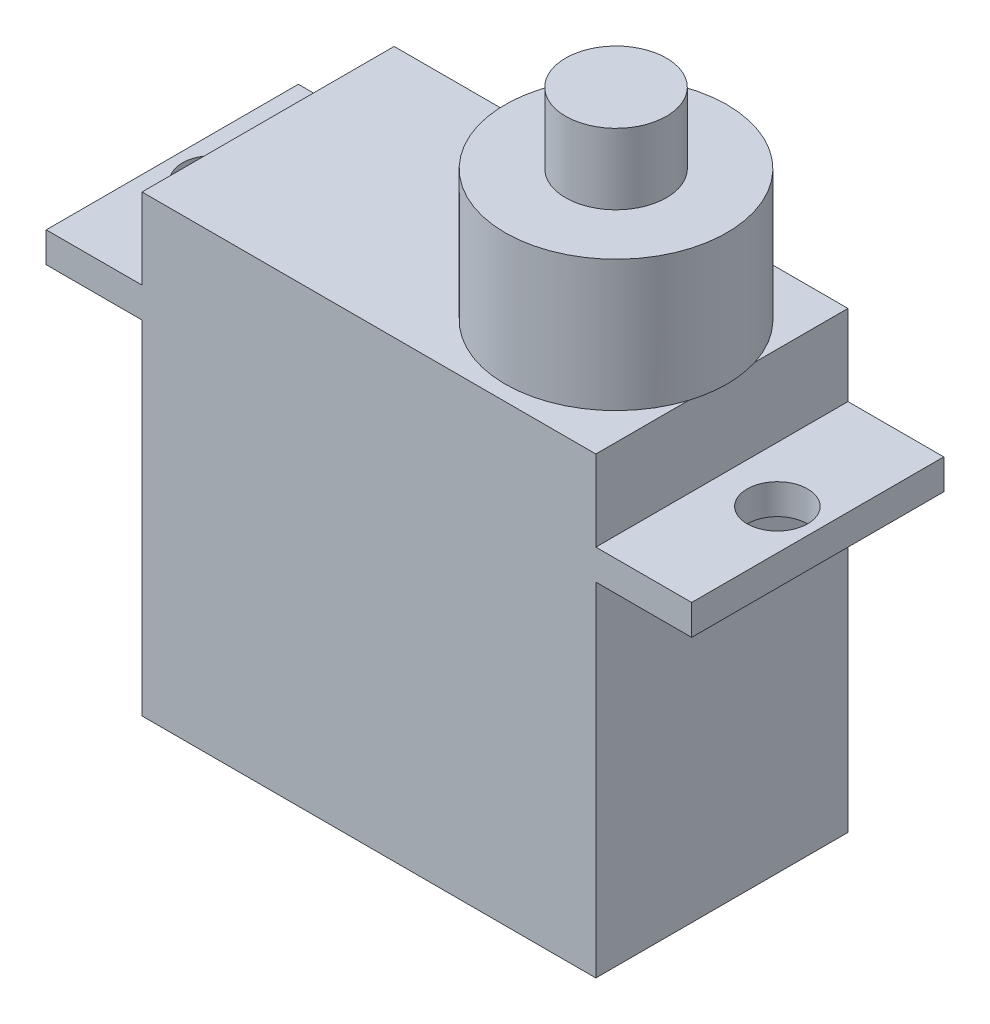
ISO-10303-21;
HEADER;
FILE_DESCRIPTION(('STEP AP214'),'2;1');
FILE_NAME('part.step','',(''),(''),'','','');
FILE_SCHEMA(('AUTOMOTIVE_DESIGN { 1 0 10303 214 1 1 1 1 }'));
ENDSEC;
DATA;
#1=APPLICATION_CONTEXT('core data for automotive mechanical design processes');
#2=APPLICATION_PROTOCOL_DEFINITION('international standard','automotive_design',2000,#1);
#3=PRODUCT_CONTEXT('',#1,'mechanical');
#4=PRODUCT('Part','Part','',(#3));
#5=PRODUCT_RELATED_PRODUCT_CATEGORY('part','',(#4));
#6=PRODUCT_DEFINITION_FORMATION('','',#4);
#7=PRODUCT_DEFINITION_CONTEXT('part definition',#1,'design');
#8=PRODUCT_DEFINITION('design','',#6,#7);
#9=PRODUCT_DEFINITION_SHAPE('','',#8);
#10=(LENGTH_UNIT() NAMED_UNIT(*) SI_UNIT(.MILLI.,.METRE.));
#11=(NAMED_UNIT(*) PLANE_ANGLE_UNIT() SI_UNIT($,.RADIAN.));
#12=(NAMED_UNIT(*) SI_UNIT($,.STERADIAN.) SOLID_ANGLE_UNIT());
#13=UNCERTAINTY_MEASURE_WITH_UNIT(LENGTH_MEASURE(1.E-05),#10,'distance_accuracy_value','');
#14=(GEOMETRIC_REPRESENTATION_CONTEXT(3) GLOBAL_UNCERTAINTY_ASSIGNED_CONTEXT((#13)) GLOBAL_UNIT_ASSIGNED_CONTEXT((#10,
#11,#12)) REPRESENTATION_CONTEXT('',''));
#15=CARTESIAN_POINT('',(0.,0.,0.));
#16=DIRECTION('',(0.,0.,1.));
#17=DIRECTION('',(1.,0.,0.));
#18=AXIS2_PLACEMENT_3D('',#15,#16,#17);
#19=CARTESIAN_POINT('',(0.,18.5,0.));
#20=DIRECTION('',(0.,1.,0.));
#21=DIRECTION('',(0.,0.,1.));
#22=AXIS2_PLACEMENT_3D('',#19,#20,#21);
#23=PLANE('',#22);
#24=DIRECTION('',(0.,0.,-1.));
#25=VECTOR('',#24,1.);
#26=CARTESIAN_POINT('',(22.5,18.5,0.));
#27=LINE('',#26,#25);
#28=CARTESIAN_POINT('',(22.5,18.5,12.5));
#29=VERTEX_POINT('',#28);
#30=CARTESIAN_POINT('',(22.5,18.5,0.));
#31=VERTEX_POINT('',#30);
#32=EDGE_CURVE('E66',#29,#31,#27,.T.);
#33=ORIENTED_EDGE('',*,*,#32,.F.);
#34=DIRECTION('',(1.,0.,0.));
#35=VECTOR('',#34,1.);
#36=CARTESIAN_POINT('',(-4.75,18.5,12.5));
#37=LINE('',#36,#35);
#38=CARTESIAN_POINT('',(27.25,18.5,12.5));
#39=VERTEX_POINT('',#38);
#40=EDGE_CURVE('E232',#29,#39,#37,.T.);
#41=ORIENTED_EDGE('',*,*,#40,.T.);
#42=DIRECTION('',(0.,0.,-1.));
#43=VECTOR('',#42,1.);
#44=CARTESIAN_POINT('',(27.25,18.5,0.));
#45=LINE('',#44,#43);
#46=CARTESIAN_POINT('',(27.25,18.5,0.));
#47=VERTEX_POINT('',#46);
#48=EDGE_CURVE('E220',#39,#47,#45,.T.);
#49=ORIENTED_EDGE('',*,*,#48,.T.);
#50=DIRECTION('',(-1.,0.,0.));
#51=VECTOR('',#50,1.);
#52=CARTESIAN_POINT('',(-4.75000000000001,18.5,0.));
#53=LINE('',#52,#51);
#54=EDGE_CURVE('E226',#47,#31,#53,.T.);
#55=ORIENTED_EDGE('',*,*,#54,.T.);
#56=EDGE_LOOP('',(#33,#41,#49,#55));
#57=FACE_BOUND('',#56,.T.);
#58=CARTESIAN_POINT('',(25.25,18.5,6.25));
#59=DIRECTION('',(0.,1.,0.));
#60=DIRECTION('',(0.,0.,1.));
#61=AXIS2_PLACEMENT_3D('',#58,#59,#60);
#62=CIRCLE('',#61,1.5);
#63=CARTESIAN_POINT('',(25.25,18.5,7.75));
#64=VERTEX_POINT('',#63);
#65=EDGE_CURVE('E204',#64,#64,#62,.T.);
#66=ORIENTED_EDGE('',*,*,#65,.F.);
#67=EDGE_LOOP('',(#66));
#68=FACE_BOUND('',#67,.T.);
#69=ADVANCED_FACE('F41',(#57,#68),#23,.T.);
#70=CARTESIAN_POINT('',(0.,17.,0.));
#71=DIRECTION('',(1.,0.,0.));
#72=DIRECTION('',(0.,0.,-1.));
#73=AXIS2_PLACEMENT_3D('',#70,#71,#72);
#74=PLANE('',#73);
#75=DIRECTION('',(0.,0.,1.));
#76=VECTOR('',#75,1.);
#77=CARTESIAN_POINT('',(0.,0.,0.));
#78=LINE('',#77,#76);
#79=CARTESIAN_POINT('',(0.,0.,0.));
#80=VERTEX_POINT('',#79);
#81=CARTESIAN_POINT('',(0.,0.,12.5));
#82=VERTEX_POINT('',#81);
#83=EDGE_CURVE('E267',#80,#82,#78,.T.);
#84=ORIENTED_EDGE('',*,*,#83,.T.);
#85=DIRECTION('',(0.,-1.,0.));
#86=VECTOR('',#85,1.);
#87=CARTESIAN_POINT('',(0.,17.,12.5));
#88=LINE('',#87,#86);
#89=CARTESIAN_POINT('',(0.,17.,12.5));
#90=VERTEX_POINT('',#89);
#91=EDGE_CURVE('E45',#90,#82,#88,.T.);
#92=ORIENTED_EDGE('',*,*,#91,.F.);
#93=DIRECTION('',(0.,0.,1.));
#94=VECTOR('',#93,1.);
#95=CARTESIAN_POINT('',(0.,17.,0.));
#96=LINE('',#95,#94);
#97=CARTESIAN_POINT('',(0.,17.,0.));
#98=VERTEX_POINT('',#97);
#99=EDGE_CURVE('E268',#98,#90,#96,.T.);
#100=ORIENTED_EDGE('',*,*,#99,.F.);
#101=DIRECTION('',(0.,-1.,0.));
#102=VECTOR('',#101,1.);
#103=CARTESIAN_POINT('',(0.,17.,0.));
#104=LINE('',#103,#102);
#105=EDGE_CURVE('E277',#98,#80,#104,.T.);
#106=ORIENTED_EDGE('',*,*,#105,.T.);
#107=EDGE_LOOP('',(#84,#92,#100,#106));
#108=FACE_BOUND('',#107,.T.);
#109=ADVANCED_FACE('F43',(#108),#74,.F.);
#110=CARTESIAN_POINT('',(0.,17.,12.5));
#111=DIRECTION('',(0.,0.,-1.));
#112=DIRECTION('',(-1.,0.,0.));
#113=AXIS2_PLACEMENT_3D('',#110,#111,#112);
#114=PLANE('',#113);
#115=DIRECTION('',(1.,0.,0.));
#116=VECTOR('',#115,1.);
#117=CARTESIAN_POINT('',(0.,0.,12.5));
#118=LINE('',#117,#116);
#119=CARTESIAN_POINT('',(22.5,0.,12.5));
#120=VERTEX_POINT('',#119);
#121=EDGE_CURVE('E281',#82,#120,#118,.T.);
#122=ORIENTED_EDGE('',*,*,#121,.T.);
#123=DIRECTION('',(0.,-1.,0.));
#124=VECTOR('',#123,1.);
#125=CARTESIAN_POINT('',(22.5,17.,12.5));
#126=LINE('',#125,#124);
#127=CARTESIAN_POINT('',(22.5,17.,12.5));
#128=VERTEX_POINT('',#127);
#129=EDGE_CURVE('E295',#128,#120,#126,.T.);
#130=ORIENTED_EDGE('',*,*,#129,.F.);
#131=DIRECTION('',(1.,0.,0.));
#132=VECTOR('',#131,1.);
#133=CARTESIAN_POINT('',(-4.75,17.,12.5));
#134=LINE('',#133,#132);
#135=CARTESIAN_POINT('',(27.25,17.,12.5));
#136=VERTEX_POINT('',#135);
#137=EDGE_CURVE('E248',#128,#136,#134,.T.);
#138=ORIENTED_EDGE('',*,*,#137,.T.);
#139=DIRECTION('',(0.,-1.,0.));
#140=VECTOR('',#139,1.);
#141=CARTESIAN_POINT('',(27.25,18.5,12.5));
#142=LINE('',#141,#140);
#143=EDGE_CURVE('E236',#39,#136,#142,.T.);
#144=ORIENTED_EDGE('',*,*,#143,.F.);
#145=ORIENTED_EDGE('',*,*,#40,.F.);
#146=DIRECTION('',(0.,-1.,0.));
#147=VECTOR('',#146,1.);
#148=CARTESIAN_POINT('',(22.5,70.7390753524675,12.5));
#149=LINE('',#148,#147);
#150=CARTESIAN_POINT('',(22.5,22.5,12.5));
#151=VERTEX_POINT('',#150);
#152=EDGE_CURVE('E170',#151,#29,#149,.T.);
#153=ORIENTED_EDGE('',*,*,#152,.F.);
#154=DIRECTION('',(1.,0.,0.));
#155=VECTOR('',#154,1.);
#156=CARTESIAN_POINT('',(0.,22.5,12.5));
#157=LINE('',#156,#155);
#158=CARTESIAN_POINT('',(0.,22.5,12.5));
#159=VERTEX_POINT('',#158);
#160=EDGE_CURVE('E142',#159,#151,#157,.T.);
#161=ORIENTED_EDGE('',*,*,#160,.F.);
#162=DIRECTION('',(0.,-1.,0.));
#163=VECTOR('',#162,1.);
#164=CARTESIAN_POINT('',(0.,70.7390753524675,12.5));
#165=LINE('',#164,#163);
#166=CARTESIAN_POINT('',(0.,18.5,12.5));
#167=VERTEX_POINT('',#166);
#168=EDGE_CURVE('E179',#159,#167,#165,.T.);
#169=ORIENTED_EDGE('',*,*,#168,.T.);
#170=CARTESIAN_POINT('',(-4.75,18.5,12.5));
#171=VERTEX_POINT('',#170);
#172=EDGE_CURVE('E233',#171,#167,#37,.T.);
#173=ORIENTED_EDGE('',*,*,#172,.F.);
#174=DIRECTION('',(0.,-1.,0.));
#175=VECTOR('',#174,1.);
#176=CARTESIAN_POINT('',(-4.75,18.5,12.5));
#177=LINE('',#176,#175);
#178=CARTESIAN_POINT('',(-4.75,17.,12.5));
#179=VERTEX_POINT('',#178);
#180=EDGE_CURVE('E255',#171,#179,#177,.T.);
#181=ORIENTED_EDGE('',*,*,#180,.T.);
#182=EDGE_CURVE('E225',#179,#90,#134,.T.);
#183=ORIENTED_EDGE('',*,*,#182,.T.);
#184=ORIENTED_EDGE('',*,*,#91,.T.);
#185=EDGE_LOOP('',(#122,#130,#138,#144,#145,#153,#161,#169,#173,#181,#183,#184));
#186=FACE_BOUND('',#185,.T.);
#187=ADVANCED_FACE('F304',(#186),#114,.F.);
#188=CARTESIAN_POINT('',(22.5,17.,0.));
#189=DIRECTION('',(-1.,0.,0.));
#190=DIRECTION('',(0.,0.,1.));
#191=AXIS2_PLACEMENT_3D('',#188,#189,#190);
#192=PLANE('',#191);
#193=DIRECTION('',(0.,0.,-1.));
#194=VECTOR('',#193,1.);
#195=CARTESIAN_POINT('',(22.5,0.,0.));
#196=LINE('',#195,#194);
#197=CARTESIAN_POINT('',(22.5,0.,0.));
#198=VERTEX_POINT('',#197);
#199=EDGE_CURVE('E284',#120,#198,#196,.T.);
#200=ORIENTED_EDGE('',*,*,#199,.T.);
#201=DIRECTION('',(0.,-1.,0.));
#202=VECTOR('',#201,1.);
#203=CARTESIAN_POINT('',(22.5,17.,0.));
#204=LINE('',#203,#202);
#205=CARTESIAN_POINT('',(22.5,17.,0.));
#206=VERTEX_POINT('',#205);
#207=EDGE_CURVE('E292',#206,#198,#204,.T.);
#208=ORIENTED_EDGE('',*,*,#207,.F.);
#209=DIRECTION('',(0.,0.,-1.));
#210=VECTOR('',#209,1.);
#211=CARTESIAN_POINT('',(22.5,17.,0.));
#212=LINE('',#211,#210);
#213=EDGE_CURVE('E272',#128,#206,#212,.T.);
#214=ORIENTED_EDGE('',*,*,#213,.F.);
#215=ORIENTED_EDGE('',*,*,#129,.T.);
#216=EDGE_LOOP('',(#200,#208,#214,#215));
#217=FACE_BOUND('',#216,.T.);
#218=ADVANCED_FACE('F312',(#217),#192,.F.);
#219=CARTESIAN_POINT('',(0.,17.,0.));
#220=DIRECTION('',(0.,0.,1.));
#221=DIRECTION('',(1.,0.,0.));
#222=AXIS2_PLACEMENT_3D('',#219,#220,#221);
#223=PLANE('',#222);
#224=DIRECTION('',(-1.,0.,0.));
#225=VECTOR('',#224,1.);
#226=CARTESIAN_POINT('',(0.,0.,0.));
#227=LINE('',#226,#225);
#228=EDGE_CURVE('E273',#198,#80,#227,.T.);
#229=ORIENTED_EDGE('',*,*,#228,.T.);
#230=ORIENTED_EDGE('',*,*,#105,.F.);
#231=DIRECTION('',(-1.,0.,0.));
#232=VECTOR('',#231,1.);
#233=CARTESIAN_POINT('',(-4.75000000000001,17.,0.));
#234=LINE('',#233,#232);
#235=CARTESIAN_POINT('',(-4.75000000000001,17.,0.));
#236=VERTEX_POINT('',#235);
#237=EDGE_CURVE('E240',#98,#236,#234,.T.);
#238=ORIENTED_EDGE('',*,*,#237,.T.);
#239=DIRECTION('',(0.,-1.,0.));
#240=VECTOR('',#239,1.);
#241=CARTESIAN_POINT('',(-4.75000000000001,18.5,0.));
#242=LINE('',#241,#240);
#243=CARTESIAN_POINT('',(-4.75000000000001,18.5,0.));
#244=VERTEX_POINT('',#243);
#245=EDGE_CURVE('E259',#244,#236,#242,.T.);
#246=ORIENTED_EDGE('',*,*,#245,.F.);
#247=CARTESIAN_POINT('',(0.,18.5,0.));
#248=VERTEX_POINT('',#247);
#249=EDGE_CURVE('E224',#248,#244,#53,.T.);
#250=ORIENTED_EDGE('',*,*,#249,.F.);
#251=DIRECTION('',(0.,-1.,0.));
#252=VECTOR('',#251,1.);
#253=CARTESIAN_POINT('',(0.,70.7390753524675,0.));
#254=LINE('',#253,#252);
#255=CARTESIAN_POINT('',(0.,22.5,0.));
#256=VERTEX_POINT('',#255);
#257=EDGE_CURVE('E180',#256,#248,#254,.T.);
#258=ORIENTED_EDGE('',*,*,#257,.F.);
#259=DIRECTION('',(-1.,0.,0.));
#260=VECTOR('',#259,1.);
#261=CARTESIAN_POINT('',(0.,22.5,0.));
#262=LINE('',#261,#260);
#263=CARTESIAN_POINT('',(22.5,22.5,0.));
#264=VERTEX_POINT('',#263);
#265=EDGE_CURVE('E146',#264,#256,#262,.T.);
#266=ORIENTED_EDGE('',*,*,#265,.F.);
#267=DIRECTION('',(0.,-1.,0.));
#268=VECTOR('',#267,1.);
#269=CARTESIAN_POINT('',(22.5,70.7390753524675,0.));
#270=LINE('',#269,#268);
#271=EDGE_CURVE('E183',#264,#31,#270,.T.);
#272=ORIENTED_EDGE('',*,*,#271,.T.);
#273=ORIENTED_EDGE('',*,*,#54,.F.);
#274=DIRECTION('',(0.,-1.,0.));
#275=VECTOR('',#274,1.);
#276=CARTESIAN_POINT('',(27.25,18.5,0.));
#277=LINE('',#276,#275);
#278=CARTESIAN_POINT('',(27.25,17.,0.));
#279=VERTEX_POINT('',#278);
#280=EDGE_CURVE('E263',#47,#279,#277,.T.);
#281=ORIENTED_EDGE('',*,*,#280,.T.);
#282=EDGE_CURVE('E241',#279,#206,#234,.T.);
#283=ORIENTED_EDGE('',*,*,#282,.T.);
#284=ORIENTED_EDGE('',*,*,#207,.T.);
#285=EDGE_LOOP('',(#229,#230,#238,#246,#250,#258,#266,#272,#273,#281,#283,#284));
#286=FACE_BOUND('',#285,.T.);
#287=ADVANCED_FACE('F314',(#286),#223,.F.);
#288=CARTESIAN_POINT('',(0.,0.,0.));
#289=DIRECTION('',(0.,1.,0.));
#290=DIRECTION('',(0.,0.,1.));
#291=AXIS2_PLACEMENT_3D('',#288,#289,#290);
#292=PLANE('',#291);
#293=ORIENTED_EDGE('',*,*,#83,.F.);
#294=ORIENTED_EDGE('',*,*,#228,.F.);
#295=ORIENTED_EDGE('',*,*,#199,.F.);
#296=ORIENTED_EDGE('',*,*,#121,.F.);
#297=EDGE_LOOP('',(#293,#294,#295,#296));
#298=FACE_BOUND('',#297,.T.);
#299=ADVANCED_FACE('F311',(#298),#292,.F.);
#300=CARTESIAN_POINT('',(0.,17.,0.));
#301=DIRECTION('',(0.,1.,0.));
#302=DIRECTION('',(0.,0.,1.));
#303=AXIS2_PLACEMENT_3D('',#300,#301,#302);
#304=PLANE('',#303);
#305=CARTESIAN_POINT('',(-2.75,17.,6.25));
#306=DIRECTION('',(0.,1.,0.));
#307=DIRECTION('',(0.,0.,1.));
#308=AXIS2_PLACEMENT_3D('',#305,#306,#307);
#309=CIRCLE('',#308,1.5);
#310=CARTESIAN_POINT('',(-2.75,17.,7.75));
#311=VERTEX_POINT('',#310);
#312=EDGE_CURVE('E208',#311,#311,#309,.T.);
#313=ORIENTED_EDGE('',*,*,#312,.T.);
#314=EDGE_LOOP('',(#313));
#315=FACE_BOUND('',#314,.T.);
#316=ORIENTED_EDGE('',*,*,#237,.F.);
#317=ORIENTED_EDGE('',*,*,#99,.T.);
#318=ORIENTED_EDGE('',*,*,#182,.F.);
#319=DIRECTION('',(0.,0.,1.));
#320=VECTOR('',#319,1.);
#321=CARTESIAN_POINT('',(-4.75000000000001,17.,0.));
#322=LINE('',#321,#320);
#323=EDGE_CURVE('E245',#236,#179,#322,.T.);
#324=ORIENTED_EDGE('',*,*,#323,.F.);
#325=EDGE_LOOP('',(#316,#317,#318,#324));
#326=FACE_BOUND('',#325,.T.);
#327=ADVANCED_FACE('F369',(#315,#326),#304,.F.);
#328=CARTESIAN_POINT('',(25.25,17.,6.25));
#329=DIRECTION('',(0.,1.,0.));
#330=DIRECTION('',(0.,0.,1.));
#331=AXIS2_PLACEMENT_3D('',#328,#329,#330);
#332=CIRCLE('',#331,1.5);
#333=CARTESIAN_POINT('',(25.25,17.,7.75));
#334=VERTEX_POINT('',#333);
#335=EDGE_CURVE('E187',#334,#334,#332,.T.);
#336=ORIENTED_EDGE('',*,*,#335,.T.);
#337=EDGE_LOOP('',(#336));
#338=FACE_BOUND('',#337,.T.);
#339=ORIENTED_EDGE('',*,*,#137,.F.);
#340=ORIENTED_EDGE('',*,*,#213,.T.);
#341=ORIENTED_EDGE('',*,*,#282,.F.);
#342=DIRECTION('',(0.,0.,-1.));
#343=VECTOR('',#342,1.);
#344=CARTESIAN_POINT('',(27.25,17.,0.));
#345=LINE('',#344,#343);
#346=EDGE_CURVE('E216',#136,#279,#345,.T.);
#347=ORIENTED_EDGE('',*,*,#346,.F.);
#348=EDGE_LOOP('',(#339,#340,#341,#347));
#349=FACE_BOUND('',#348,.T.);
#350=ADVANCED_FACE('F319',(#338,#349),#304,.F.);
#351=DIRECTION('',(0.,0.,1.));
#352=VECTOR('',#351,1.);
#353=CARTESIAN_POINT('',(0.,18.5,0.));
#354=LINE('',#353,#352);
#355=EDGE_CURVE('E175',#248,#167,#354,.T.);
#356=ORIENTED_EDGE('',*,*,#355,.F.);
#357=ORIENTED_EDGE('',*,*,#249,.T.);
#358=DIRECTION('',(0.,0.,1.));
#359=VECTOR('',#358,1.);
#360=CARTESIAN_POINT('',(-4.75000000000001,18.5,0.));
#361=LINE('',#360,#359);
#362=EDGE_CURVE('E229',#244,#171,#361,.T.);
#363=ORIENTED_EDGE('',*,*,#362,.T.);
#364=ORIENTED_EDGE('',*,*,#172,.T.);
#365=EDGE_LOOP('',(#356,#357,#363,#364));
#366=FACE_BOUND('',#365,.T.);
#367=CARTESIAN_POINT('',(-2.75,18.5,6.25));
#368=DIRECTION('',(0.,1.,0.));
#369=DIRECTION('',(0.,0.,1.));
#370=AXIS2_PLACEMENT_3D('',#367,#368,#369);
#371=CIRCLE('',#370,1.5);
#372=CARTESIAN_POINT('',(-2.75,18.5,7.75));
#373=VERTEX_POINT('',#372);
#374=EDGE_CURVE('E212',#373,#373,#371,.T.);
#375=ORIENTED_EDGE('',*,*,#374,.F.);
#376=EDGE_LOOP('',(#375));
#377=FACE_BOUND('',#376,.T.);
#378=ADVANCED_FACE('F332',(#366,#377),#23,.T.);
#379=CARTESIAN_POINT('',(27.25,18.5,0.));
#380=DIRECTION('',(-1.,0.,0.));
#381=DIRECTION('',(0.,0.,1.));
#382=AXIS2_PLACEMENT_3D('',#379,#380,#381);
#383=PLANE('',#382);
#384=ORIENTED_EDGE('',*,*,#346,.T.);
#385=ORIENTED_EDGE('',*,*,#280,.F.);
#386=ORIENTED_EDGE('',*,*,#48,.F.);
#387=ORIENTED_EDGE('',*,*,#143,.T.);
#388=EDGE_LOOP('',(#384,#385,#386,#387));
#389=FACE_BOUND('',#388,.T.);
#390=ADVANCED_FACE('F362',(#389),#383,.F.);
#391=CARTESIAN_POINT('',(-4.75000000000001,18.5,0.));
#392=DIRECTION('',(1.,0.,0.));
#393=DIRECTION('',(0.,0.,-1.));
#394=AXIS2_PLACEMENT_3D('',#391,#392,#393);
#395=PLANE('',#394);
#396=ORIENTED_EDGE('',*,*,#323,.T.);
#397=ORIENTED_EDGE('',*,*,#180,.F.);
#398=ORIENTED_EDGE('',*,*,#362,.F.);
#399=ORIENTED_EDGE('',*,*,#245,.T.);
#400=EDGE_LOOP('',(#396,#397,#398,#399));
#401=FACE_BOUND('',#400,.T.);
#402=ADVANCED_FACE('F339',(#401),#395,.F.);
#403=CARTESIAN_POINT('',(-2.75,18.5,6.25));
#404=DIRECTION('',(0.,-1.,0.));
#405=DIRECTION('',(0.,0.,-1.));
#406=AXIS2_PLACEMENT_3D('',#403,#404,#405);
#407=CYLINDRICAL_SURFACE('',#406,1.5);
#408=ORIENTED_EDGE('',*,*,#374,.T.);
#409=EDGE_LOOP('',(#408));
#410=FACE_BOUND('',#409,.T.);
#411=ORIENTED_EDGE('',*,*,#312,.F.);
#412=EDGE_LOOP('',(#411));
#413=FACE_BOUND('',#412,.T.);
#414=ADVANCED_FACE('F377',(#410,#413),#407,.F.);
#415=CARTESIAN_POINT('',(25.25,18.5,6.25));
#416=DIRECTION('',(0.,-1.,0.));
#417=DIRECTION('',(0.,0.,-1.));
#418=AXIS2_PLACEMENT_3D('',#415,#416,#417);
#419=CYLINDRICAL_SURFACE('',#418,1.5);
#420=ORIENTED_EDGE('',*,*,#65,.T.);
#421=EDGE_LOOP('',(#420));
#422=FACE_BOUND('',#421,.T.);
#423=ORIENTED_EDGE('',*,*,#335,.F.);
#424=EDGE_LOOP('',(#423));
#425=FACE_BOUND('',#424,.T.);
#426=ADVANCED_FACE('F350',(#422,#425),#419,.F.);
#427=CARTESIAN_POINT('',(22.5,70.7390753524675,0.));
#428=DIRECTION('',(-1.,0.,0.));
#429=DIRECTION('',(0.,0.,1.));
#430=AXIS2_PLACEMENT_3D('',#427,#428,#429);
#431=PLANE('',#430);
#432=DIRECTION('',(0.,0.,-1.));
#433=VECTOR('',#432,1.);
#434=CARTESIAN_POINT('',(22.5,22.5,0.));
#435=LINE('',#434,#433);
#436=CARTESIAN_POINT('',(22.5,22.5,7.8893596310755));
#437=VERTEX_POINT('',#436);
#438=EDGE_CURVE('E137',#151,#437,#435,.T.);
#439=ORIENTED_EDGE('',*,*,#438,.F.);
#440=ORIENTED_EDGE('',*,*,#152,.T.);
#441=ORIENTED_EDGE('',*,*,#32,.T.);
#442=ORIENTED_EDGE('',*,*,#271,.F.);
#443=CARTESIAN_POINT('',(22.5,22.5,4.61064036892451));
#444=VERTEX_POINT('',#443);
#445=EDGE_CURVE('E149',#444,#264,#435,.T.);
#446=ORIENTED_EDGE('',*,*,#445,.F.);
#447=EDGE_CURVE('E147',#437,#444,#435,.T.);
#448=ORIENTED_EDGE('',*,*,#447,.F.);
#449=EDGE_LOOP('',(#439,#440,#441,#442,#446,#448));
#450=FACE_BOUND('',#449,.T.);
#451=ADVANCED_FACE('F151',(#450),#431,.F.);
#452=CARTESIAN_POINT('',(0.,70.7390753524675,0.));
#453=DIRECTION('',(1.,0.,0.));
#454=DIRECTION('',(0.,0.,-1.));
#455=AXIS2_PLACEMENT_3D('',#452,#453,#454);
#456=PLANE('',#455);
#457=DIRECTION('',(0.,0.,1.));
#458=VECTOR('',#457,1.);
#459=CARTESIAN_POINT('',(0.,22.5,0.));
#460=LINE('',#459,#458);
#461=EDGE_CURVE('E184',#256,#159,#460,.T.);
#462=ORIENTED_EDGE('',*,*,#461,.F.);
#463=ORIENTED_EDGE('',*,*,#257,.T.);
#464=ORIENTED_EDGE('',*,*,#355,.T.);
#465=ORIENTED_EDGE('',*,*,#168,.F.);
#466=EDGE_LOOP('',(#462,#463,#464,#465));
#467=FACE_BOUND('',#466,.T.);
#468=ADVANCED_FACE('F342',(#467),#456,.F.);
#469=CARTESIAN_POINT('',(0.,22.5,0.));
#470=DIRECTION('',(0.,1.,0.));
#471=DIRECTION('',(0.,0.,1.));
#472=AXIS2_PLACEMENT_3D('',#469,#470,#471);
#473=PLANE('',#472);
#474=CARTESIAN_POINT('',(17.25,22.5,6.25));
#475=DIRECTION('',(0.,1.,0.));
#476=DIRECTION('',(0.,0.,1.));
#477=AXIS2_PLACEMENT_3D('',#474,#475,#476);
#478=CIRCLE('',#477,5.5);
#479=EDGE_CURVE('E51',#444,#437,#478,.T.);
#480=ORIENTED_EDGE('',*,*,#479,.F.);
#481=ORIENTED_EDGE('',*,*,#445,.T.);
#482=ORIENTED_EDGE('',*,*,#265,.T.);
#483=ORIENTED_EDGE('',*,*,#461,.T.);
#484=ORIENTED_EDGE('',*,*,#160,.T.);
#485=ORIENTED_EDGE('',*,*,#438,.T.);
#486=EDGE_LOOP('',(#480,#481,#482,#483,#484,#485));
#487=FACE_BOUND('',#486,.T.);
#488=ADVANCED_FACE('F139',(#487),#473,.T.);
#489=CARTESIAN_POINT('',(17.25,22.5,6.25));
#490=DIRECTION('',(0.,1.,0.));
#491=DIRECTION('',(0.,0.,1.));
#492=AXIS2_PLACEMENT_3D('',#489,#490,#491);
#493=PLANE('',#492);
#494=EDGE_CURVE('E160',#437,#444,#478,.T.);
#495=ORIENTED_EDGE('',*,*,#494,.F.);
#496=ORIENTED_EDGE('',*,*,#447,.T.);
#497=EDGE_LOOP('',(#495,#496));
#498=FACE_BOUND('',#497,.T.);
#499=ADVANCED_FACE('F163',(#498),#493,.F.);
#500=CARTESIAN_POINT('',(17.25,73.556349186104,6.25));
#501=DIRECTION('',(0.,-1.,0.));
#502=DIRECTION('',(0.,0.,-1.));
#503=AXIS2_PLACEMENT_3D('',#500,#501,#502);
#504=CYLINDRICAL_SURFACE('',#503,5.5);
#505=ORIENTED_EDGE('',*,*,#494,.T.);
#506=ORIENTED_EDGE('',*,*,#479,.T.);
#507=EDGE_LOOP('',(#505,#506));
#508=FACE_BOUND('',#507,.T.);
#509=CARTESIAN_POINT('',(17.25,29.,6.25));
#510=DIRECTION('',(0.,1.,0.));
#511=DIRECTION('',(0.,0.,1.));
#512=AXIS2_PLACEMENT_3D('',#509,#510,#511);
#513=CIRCLE('',#512,5.5);
#514=CARTESIAN_POINT('',(17.25,29.,11.75));
#515=VERTEX_POINT('',#514);
#516=EDGE_CURVE('E165',#515,#515,#513,.T.);
#517=ORIENTED_EDGE('',*,*,#516,.F.);
#518=EDGE_LOOP('',(#517));
#519=FACE_BOUND('',#518,.T.);
#520=ADVANCED_FACE('F158',(#508,#519),#504,.T.);
#521=CARTESIAN_POINT('',(0.,29.,0.));
#522=DIRECTION('',(0.,1.,0.));
#523=DIRECTION('',(0.,0.,1.));
#524=AXIS2_PLACEMENT_3D('',#521,#522,#523);
#525=PLANE('',#524);
#526=CARTESIAN_POINT('',(17.25,29.,6.25));
#527=DIRECTION('',(0.,1.,0.));
#528=DIRECTION('',(0.,0.,1.));
#529=AXIS2_PLACEMENT_3D('',#526,#527,#528);
#530=CIRCLE('',#529,2.5);
#531=CARTESIAN_POINT('',(17.25,29.,8.75));
#532=VERTEX_POINT('',#531);
#533=EDGE_CURVE('E12',#532,#532,#530,.T.);
#534=ORIENTED_EDGE('',*,*,#533,.F.);
#535=EDGE_LOOP('',(#534));
#536=FACE_BOUND('',#535,.T.);
#537=ORIENTED_EDGE('',*,*,#516,.T.);
#538=EDGE_LOOP('',(#537));
#539=FACE_BOUND('',#538,.T.);
#540=ADVANCED_FACE('F486',(#536,#539),#525,.T.);
#541=CARTESIAN_POINT('',(17.25,32.5,6.25));
#542=DIRECTION('',(0.,-1.,0.));
#543=DIRECTION('',(0.,0.,-1.));
#544=AXIS2_PLACEMENT_3D('',#541,#542,#543);
#545=CYLINDRICAL_SURFACE('',#544,2.5);
#546=CARTESIAN_POINT('',(17.25,32.5,6.25));
#547=DIRECTION('',(0.,1.,0.));
#548=DIRECTION('',(0.,0.,1.));
#549=AXIS2_PLACEMENT_3D('',#546,#547,#548);
#550=CIRCLE('',#549,2.5);
#551=CARTESIAN_POINT('',(17.25,32.5,8.75));
#552=VERTEX_POINT('',#551);
#553=EDGE_CURVE('E166',#552,#552,#550,.T.);
#554=ORIENTED_EDGE('',*,*,#553,.F.);
#555=EDGE_LOOP('',(#554));
#556=FACE_BOUND('',#555,.T.);
#557=ORIENTED_EDGE('',*,*,#533,.T.);
#558=EDGE_LOOP('',(#557));
#559=FACE_BOUND('',#558,.T.);
#560=ADVANCED_FACE('F494',(#556,#559),#545,.T.);
#561=CARTESIAN_POINT('',(17.25,32.5,6.25));
#562=DIRECTION('',(0.,1.,0.));
#563=DIRECTION('',(0.,0.,1.));
#564=AXIS2_PLACEMENT_3D('',#561,#562,#563);
#565=PLANE('',#564);
#566=ORIENTED_EDGE('',*,*,#553,.T.);
#567=EDGE_LOOP('',(#566));
#568=FACE_BOUND('',#567,.T.);
#569=ADVANCED_FACE('F502',(#568),#565,.T.);
#570=CLOSED_SHELL('',(#69,#109,#187,#218,#287,#299,#327,#350,#378,#390,#402,#414,#426,#451,#468,
#488,#499,#520,#540,#560,#569));
#571=MANIFOLD_SOLID_BREP('B2',#570);
#572=ADVANCED_BREP_SHAPE_REPRESENTATION('',(#18,#571),#14);
#573=SHAPE_DEFINITION_REPRESENTATION(#9,#572);
ENDSEC;
END-ISO-10303-21;
